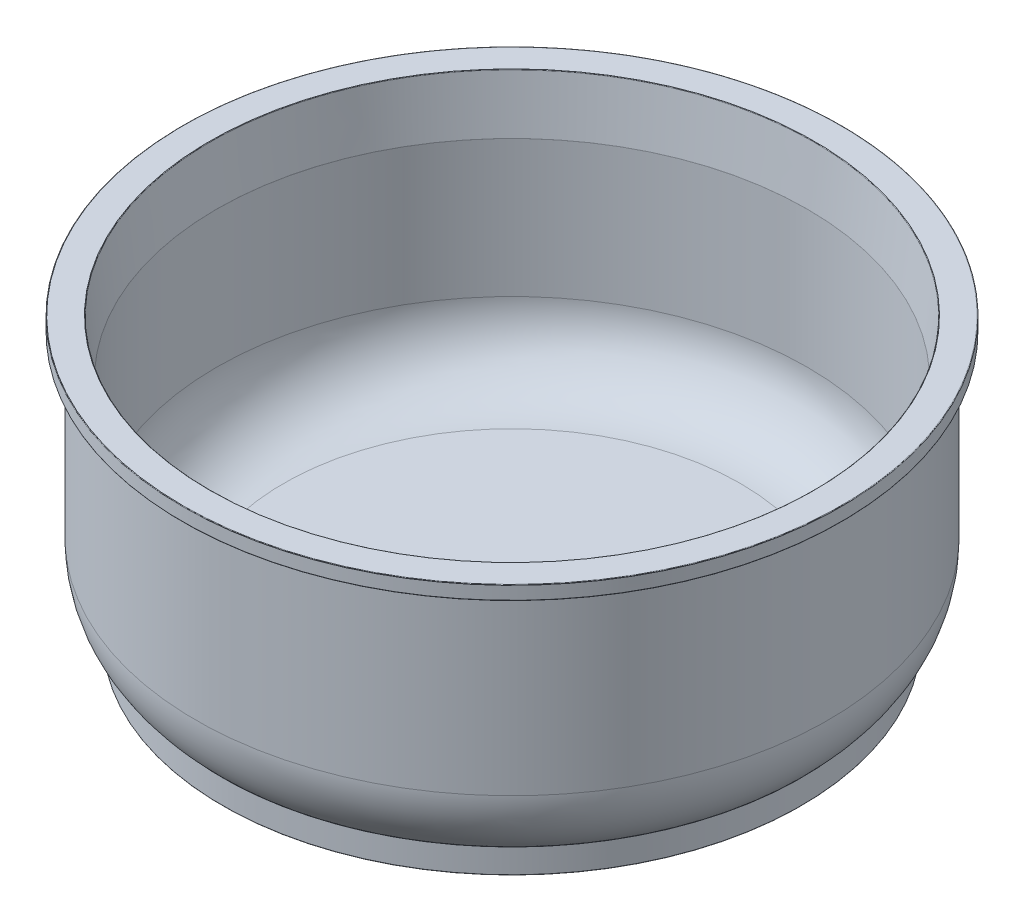
ISO-10303-21;
HEADER;
FILE_DESCRIPTION(('STEP AP214'),'2;1');
FILE_NAME('part.step','',(''),(''),'','','');
FILE_SCHEMA(('AUTOMOTIVE_DESIGN { 1 0 10303 214 1 1 1 1 }'));
ENDSEC;
DATA;
#1=APPLICATION_CONTEXT('core data for automotive mechanical design processes');
#2=APPLICATION_PROTOCOL_DEFINITION('international standard','automotive_design',2000,#1);
#3=PRODUCT_CONTEXT('',#1,'mechanical');
#4=PRODUCT('Part','Part','',(#3));
#5=PRODUCT_RELATED_PRODUCT_CATEGORY('part','',(#4));
#6=PRODUCT_DEFINITION_FORMATION('','',#4);
#7=PRODUCT_DEFINITION_CONTEXT('part definition',#1,'design');
#8=PRODUCT_DEFINITION('design','',#6,#7);
#9=PRODUCT_DEFINITION_SHAPE('','',#8);
#10=(LENGTH_UNIT() NAMED_UNIT(*) SI_UNIT(.MILLI.,.METRE.));
#11=(NAMED_UNIT(*) PLANE_ANGLE_UNIT() SI_UNIT($,.RADIAN.));
#12=(NAMED_UNIT(*) SI_UNIT($,.STERADIAN.) SOLID_ANGLE_UNIT());
#13=UNCERTAINTY_MEASURE_WITH_UNIT(LENGTH_MEASURE(1.E-05),#10,'distance_accuracy_value','');
#14=(GEOMETRIC_REPRESENTATION_CONTEXT(3) GLOBAL_UNCERTAINTY_ASSIGNED_CONTEXT((#13)) GLOBAL_UNIT_ASSIGNED_CONTEXT((#10,
#11,#12)) REPRESENTATION_CONTEXT('',''));
#15=CARTESIAN_POINT('',(0.,0.,0.));
#16=DIRECTION('',(0.,0.,1.));
#17=DIRECTION('',(1.,0.,0.));
#18=AXIS2_PLACEMENT_3D('',#15,#16,#17);
#19=CARTESIAN_POINT('',(0.,52.39,0.));
#20=DIRECTION('',(0.,-1.,0.));
#21=DIRECTION('',(0.,0.,-1.));
#22=AXIS2_PLACEMENT_3D('',#19,#20,#21);
#23=TOROIDAL_SURFACE('',#22,136.11,40.);
#24=CARTESIAN_POINT('',(0.,52.39,0.));
#25=DIRECTION('',(0.,-1.,0.));
#26=DIRECTION('',(0.,0.,-1.));
#27=AXIS2_PLACEMENT_3D('',#24,#25,#26);
#28=CIRCLE('',#27,176.11);
#29=CARTESIAN_POINT('',(0.,52.39,-176.11));
#30=VERTEX_POINT('',#29);
#31=EDGE_CURVE('E104',#30,#30,#28,.T.);
#32=ORIENTED_EDGE('',*,*,#31,.F.);
#33=EDGE_LOOP('',(#32));
#34=FACE_BOUND('',#33,.T.);
#35=CARTESIAN_POINT('',(0.,12.39,0.));
#36=DIRECTION('',(0.,-1.,0.));
#37=DIRECTION('',(0.,0.,-1.));
#38=AXIS2_PLACEMENT_3D('',#35,#36,#37);
#39=CIRCLE('',#38,136.11);
#40=CARTESIAN_POINT('',(0.,12.39,-136.11));
#41=VERTEX_POINT('',#40);
#42=EDGE_CURVE('E95',#41,#41,#39,.T.);
#43=ORIENTED_EDGE('',*,*,#42,.T.);
#44=EDGE_LOOP('',(#43));
#45=FACE_BOUND('',#44,.T.);
#46=ADVANCED_FACE('F33',(#34,#45),#23,.F.);
#47=CARTESIAN_POINT('',(0.,12.39,0.));
#48=DIRECTION('',(0.,-1.,0.));
#49=DIRECTION('',(0.,0.,-1.));
#50=AXIS2_PLACEMENT_3D('',#47,#48,#49);
#51=PLANE('',#50);
#52=ORIENTED_EDGE('',*,*,#42,.F.);
#53=EDGE_LOOP('',(#52));
#54=FACE_BOUND('',#53,.T.);
#55=ADVANCED_FACE('F112',(#54),#51,.F.);
#56=CARTESIAN_POINT('',(0.,0.,0.));
#57=DIRECTION('',(0.,-1.,0.));
#58=DIRECTION('',(0.,0.,-1.));
#59=AXIS2_PLACEMENT_3D('',#56,#57,#58);
#60=PLANE('',#59);
#61=CARTESIAN_POINT('',(0.,0.,0.));
#62=DIRECTION('',(0.,-1.,0.));
#63=DIRECTION('',(0.,0.,-1.));
#64=AXIS2_PLACEMENT_3D('',#61,#62,#63);
#65=CIRCLE('',#64,136.11);
#66=CARTESIAN_POINT('',(0.,0.,-136.11));
#67=VERTEX_POINT('',#66);
#68=EDGE_CURVE('E98',#67,#67,#65,.T.);
#69=ORIENTED_EDGE('',*,*,#68,.T.);
#70=EDGE_LOOP('',(#69));
#71=FACE_BOUND('',#70,.T.);
#72=ADVANCED_FACE('F117',(#71),#60,.T.);
#73=CARTESIAN_POINT('',(0.,52.39,0.));
#74=DIRECTION('',(0.,-1.,0.));
#75=DIRECTION('',(0.,0.,-1.));
#76=AXIS2_PLACEMENT_3D('',#73,#74,#75);
#77=TOROIDAL_SURFACE('',#76,136.11,52.39);
#78=CARTESIAN_POINT('',(0.,7.87935811300246,0.));
#79=DIRECTION('',(0.,1.,0.));
#80=DIRECTION('',(0.,0.,1.));
#81=AXIS2_PLACEMENT_3D('',#78,#79,#80);
#82=CIRCLE('',#81,163.741772632378);
#83=CARTESIAN_POINT('',(0.,7.87935811300246,163.741772632378));
#84=VERTEX_POINT('',#83);
#85=EDGE_CURVE('E77',#84,#84,#82,.F.);
#86=ORIENTED_EDGE('',*,*,#85,.T.);
#87=EDGE_LOOP('',(#86));
#88=FACE_BOUND('',#87,.T.);
#89=ORIENTED_EDGE('',*,*,#68,.F.);
#90=EDGE_LOOP('',(#89));
#91=FACE_BOUND('',#90,.T.);
#92=ADVANCED_FACE('F122',(#88,#91),#77,.T.);
#93=CARTESIAN_POINT('',(0.,0.,0.));
#94=DIRECTION('',(0.,-1.,0.));
#95=DIRECTION('',(0.,0.,-1.));
#96=AXIS2_PLACEMENT_3D('',#93,#94,#95);
#97=CYLINDRICAL_SURFACE('',#96,164.2);
#98=CARTESIAN_POINT('',(0.,7.62447755247349,0.));
#99=DIRECTION('',(0.,-1.,0.));
#100=DIRECTION('',(0.,0.,-1.));
#101=AXIS2_PLACEMENT_3D('',#98,#99,#100);
#102=CIRCLE('',#101,164.2);
#103=CARTESIAN_POINT('',(0.,7.62447755247349,-164.2));
#104=VERTEX_POINT('',#103);
#105=EDGE_CURVE('E71',#104,#104,#102,.F.);
#106=ORIENTED_EDGE('',*,*,#105,.T.);
#107=EDGE_LOOP('',(#106));
#108=FACE_BOUND('',#107,.T.);
#109=CARTESIAN_POINT('',(0.,0.3,0.));
#110=DIRECTION('',(0.,-1.,0.));
#111=DIRECTION('',(0.,0.,-1.));
#112=AXIS2_PLACEMENT_3D('',#109,#110,#111);
#113=CIRCLE('',#112,164.2);
#114=CARTESIAN_POINT('',(0.,0.3,-164.2));
#115=VERTEX_POINT('',#114);
#116=EDGE_CURVE('E74',#115,#115,#113,.T.);
#117=ORIENTED_EDGE('',*,*,#116,.T.);
#118=EDGE_LOOP('',(#117));
#119=FACE_BOUND('',#118,.T.);
#120=ADVANCED_FACE('F194',(#108,#119),#97,.F.);
#121=CARTESIAN_POINT('',(0.,0.,0.));
#122=DIRECTION('',(0.,-1.,0.));
#123=DIRECTION('',(0.,0.,-1.));
#124=AXIS2_PLACEMENT_3D('',#121,#122,#123);
#125=PLANE('',#124);
#126=CARTESIAN_POINT('',(0.,0.,0.));
#127=DIRECTION('',(0.,-1.,0.));
#128=DIRECTION('',(0.,0.,-1.));
#129=AXIS2_PLACEMENT_3D('',#126,#127,#128);
#130=CIRCLE('',#129,164.5);
#131=CARTESIAN_POINT('',(0.,0.,-164.5));
#132=VERTEX_POINT('',#131);
#133=EDGE_CURVE('E65',#132,#132,#130,.F.);
#134=ORIENTED_EDGE('',*,*,#133,.T.);
#135=EDGE_LOOP('',(#134));
#136=FACE_BOUND('',#135,.T.);
#137=CARTESIAN_POINT('',(0.,0.,0.));
#138=DIRECTION('',(0.,-1.,0.));
#139=DIRECTION('',(0.,0.,-1.));
#140=AXIS2_PLACEMENT_3D('',#137,#138,#139);
#141=CIRCLE('',#140,172.2);
#142=CARTESIAN_POINT('',(0.,0.,-172.2));
#143=VERTEX_POINT('',#142);
#144=EDGE_CURVE('E68',#143,#143,#141,.T.);
#145=ORIENTED_EDGE('',*,*,#144,.T.);
#146=EDGE_LOOP('',(#145));
#147=FACE_BOUND('',#146,.T.);
#148=ADVANCED_FACE('F191',(#136,#147),#125,.T.);
#149=CARTESIAN_POINT('',(0.,0.,0.));
#150=DIRECTION('',(0.,-1.,0.));
#151=DIRECTION('',(0.,0.,-1.));
#152=AXIS2_PLACEMENT_3D('',#149,#150,#151);
#153=CYLINDRICAL_SURFACE('',#152,172.5);
#154=CARTESIAN_POINT('',(0.,0.3,0.));
#155=DIRECTION('',(0.,-1.,0.));
#156=DIRECTION('',(0.,0.,-1.));
#157=AXIS2_PLACEMENT_3D('',#154,#155,#156);
#158=CIRCLE('',#157,172.5);
#159=CARTESIAN_POINT('',(0.,0.3,-172.5));
#160=VERTEX_POINT('',#159);
#161=EDGE_CURVE('E59',#160,#160,#158,.F.);
#162=ORIENTED_EDGE('',*,*,#161,.T.);
#163=EDGE_LOOP('',(#162));
#164=FACE_BOUND('',#163,.T.);
#165=CARTESIAN_POINT('',(0.,14.5736014406448,0.));
#166=DIRECTION('',(0.,-1.,0.));
#167=DIRECTION('',(0.,0.,-1.));
#168=AXIS2_PLACEMENT_3D('',#165,#166,#167);
#169=CIRCLE('',#168,172.5);
#170=CARTESIAN_POINT('',(0.,14.5736014406448,-172.5));
#171=VERTEX_POINT('',#170);
#172=EDGE_CURVE('E62',#171,#171,#169,.T.);
#173=ORIENTED_EDGE('',*,*,#172,.T.);
#174=EDGE_LOOP('',(#173));
#175=FACE_BOUND('',#174,.T.);
#176=ADVANCED_FACE('F187',(#164,#175),#153,.T.);
#177=CARTESIAN_POINT('',(0.,14.7889159133684,0.));
#178=DIRECTION('',(0.,1.,0.));
#179=DIRECTION('',(0.,0.,1.));
#180=AXIS2_PLACEMENT_3D('',#177,#178,#179);
#181=CIRCLE('',#180,172.591098880243);
#182=CARTESIAN_POINT('',(0.,14.7889159133684,172.591098880243));
#183=VERTEX_POINT('',#182);
#184=EDGE_CURVE('E56',#183,#183,#181,.T.);
#185=ORIENTED_EDGE('',*,*,#184,.T.);
#186=EDGE_LOOP('',(#185));
#187=FACE_BOUND('',#186,.T.);
#188=CARTESIAN_POINT('',(0.,52.39,0.));
#189=DIRECTION('',(0.,-1.,0.));
#190=DIRECTION('',(0.,0.,-1.));
#191=AXIS2_PLACEMENT_3D('',#188,#189,#190);
#192=CIRCLE('',#191,188.5);
#193=CARTESIAN_POINT('',(0.,52.39,-188.5));
#194=VERTEX_POINT('',#193);
#195=EDGE_CURVE('E101',#194,#194,#192,.T.);
#196=ORIENTED_EDGE('',*,*,#195,.T.);
#197=EDGE_LOOP('',(#196));
#198=FACE_BOUND('',#197,.T.);
#199=ADVANCED_FACE('F184',(#187,#198),#77,.T.);
#200=CARTESIAN_POINT('',(0.,0.,0.));
#201=DIRECTION('',(0.,-1.,0.));
#202=DIRECTION('',(0.,0.,-1.));
#203=AXIS2_PLACEMENT_3D('',#200,#201,#202);
#204=CYLINDRICAL_SURFACE('',#203,188.5);
#205=CARTESIAN_POINT('',(0.,158.4,0.));
#206=DIRECTION('',(0.,-1.,0.));
#207=DIRECTION('',(0.,0.,-1.));
#208=AXIS2_PLACEMENT_3D('',#205,#206,#207);
#209=CIRCLE('',#208,188.5);
#210=CARTESIAN_POINT('',(0.,158.4,-188.5));
#211=VERTEX_POINT('',#210);
#212=EDGE_CURVE('E10',#211,#211,#209,.T.);
#213=ORIENTED_EDGE('',*,*,#212,.T.);
#214=EDGE_LOOP('',(#213));
#215=FACE_BOUND('',#214,.T.);
#216=ORIENTED_EDGE('',*,*,#195,.F.);
#217=EDGE_LOOP('',(#216));
#218=FACE_BOUND('',#217,.T.);
#219=ADVANCED_FACE('F177',(#215,#218),#204,.T.);
#220=CARTESIAN_POINT('',(0.,158.7,0.));
#221=DIRECTION('',(0.,-1.,0.));
#222=DIRECTION('',(0.,0.,-1.));
#223=AXIS2_PLACEMENT_3D('',#220,#221,#222);
#224=PLANE('',#223);
#225=CARTESIAN_POINT('',(0.,158.7,0.));
#226=DIRECTION('',(0.,-1.,0.));
#227=DIRECTION('',(0.,0.,-1.));
#228=AXIS2_PLACEMENT_3D('',#225,#226,#227);
#229=CIRCLE('',#228,196.2);
#230=CARTESIAN_POINT('',(0.,158.7,-196.2));
#231=VERTEX_POINT('',#230);
#232=EDGE_CURVE('E48',#231,#231,#229,.T.);
#233=ORIENTED_EDGE('',*,*,#232,.T.);
#234=EDGE_LOOP('',(#233));
#235=FACE_BOUND('',#234,.T.);
#236=CARTESIAN_POINT('',(0.,158.7,0.));
#237=DIRECTION('',(0.,-1.,0.));
#238=DIRECTION('',(0.,0.,-1.));
#239=AXIS2_PLACEMENT_3D('',#236,#237,#238);
#240=CIRCLE('',#239,188.8);
#241=CARTESIAN_POINT('',(0.,158.7,-188.8));
#242=VERTEX_POINT('',#241);
#243=EDGE_CURVE('E53',#242,#242,#240,.F.);
#244=ORIENTED_EDGE('',*,*,#243,.T.);
#245=EDGE_LOOP('',(#244));
#246=FACE_BOUND('',#245,.T.);
#247=ADVANCED_FACE('F168',(#235,#246),#224,.T.);
#248=CARTESIAN_POINT('',(0.,0.,0.));
#249=DIRECTION('',(0.,-1.,0.));
#250=DIRECTION('',(0.,0.,-1.));
#251=AXIS2_PLACEMENT_3D('',#248,#249,#250);
#252=CYLINDRICAL_SURFACE('',#251,196.5);
#253=CARTESIAN_POINT('',(0.,159.,0.));
#254=DIRECTION('',(0.,-1.,0.));
#255=DIRECTION('',(0.,0.,-1.));
#256=AXIS2_PLACEMENT_3D('',#253,#254,#255);
#257=CIRCLE('',#256,196.5);
#258=CARTESIAN_POINT('',(0.,159.,-196.5));
#259=VERTEX_POINT('',#258);
#260=EDGE_CURVE('E40',#259,#259,#257,.F.);
#261=ORIENTED_EDGE('',*,*,#260,.T.);
#262=EDGE_LOOP('',(#261));
#263=FACE_BOUND('',#262,.T.);
#264=CARTESIAN_POINT('',(0.,166.7,0.));
#265=DIRECTION('',(0.,1.,0.));
#266=DIRECTION('',(0.,0.,1.));
#267=AXIS2_PLACEMENT_3D('',#264,#265,#266);
#268=CIRCLE('',#267,196.5);
#269=CARTESIAN_POINT('',(0.,166.7,196.5));
#270=VERTEX_POINT('',#269);
#271=EDGE_CURVE('E44',#270,#270,#268,.F.);
#272=ORIENTED_EDGE('',*,*,#271,.T.);
#273=EDGE_LOOP('',(#272));
#274=FACE_BOUND('',#273,.T.);
#275=ADVANCED_FACE('F165',(#263,#274),#252,.T.);
#276=CARTESIAN_POINT('',(8.4276020505637E-13,167.,0.));
#277=DIRECTION('',(0.,1.,0.));
#278=DIRECTION('',(0.,0.,1.));
#279=AXIS2_PLACEMENT_3D('',#276,#277,#278);
#280=PLANE('',#279);
#281=CARTESIAN_POINT('',(0.,167.,0.));
#282=DIRECTION('',(0.,1.,0.));
#283=DIRECTION('',(0.,0.,1.));
#284=AXIS2_PLACEMENT_3D('',#281,#282,#283);
#285=CIRCLE('',#284,180.266713484215);
#286=CARTESIAN_POINT('',(0.,167.,180.266713484215));
#287=VERTEX_POINT('',#286);
#288=EDGE_CURVE('E89',#287,#287,#285,.F.);
#289=ORIENTED_EDGE('',*,*,#288,.T.);
#290=EDGE_LOOP('',(#289));
#291=FACE_BOUND('',#290,.T.);
#292=CARTESIAN_POINT('',(0.,167.,0.));
#293=DIRECTION('',(0.,1.,0.));
#294=DIRECTION('',(0.,0.,1.));
#295=AXIS2_PLACEMENT_3D('',#292,#293,#294);
#296=CIRCLE('',#295,196.2);
#297=CARTESIAN_POINT('',(0.,167.,196.2));
#298=VERTEX_POINT('',#297);
#299=EDGE_CURVE('E92',#298,#298,#296,.T.);
#300=ORIENTED_EDGE('',*,*,#299,.T.);
#301=EDGE_LOOP('',(#300));
#302=FACE_BOUND('',#301,.T.);
#303=ADVANCED_FACE('F167',(#291,#302),#280,.T.);
#304=CARTESIAN_POINT('',(0.,167.,0.));
#305=DIRECTION('',(0.,1.,0.));
#306=DIRECTION('',(0.,0.,1.));
#307=AXIS2_PLACEMENT_3D('',#304,#305,#306);
#308=CONICAL_SURFACE('',#307,180.,0.117337303935576);
#309=CARTESIAN_POINT('',(0.,166.735120471517,0.));
#310=DIRECTION('',(0.,-1.,0.));
#311=DIRECTION('',(0.,0.,-1.));
#312=AXIS2_PLACEMENT_3D('',#309,#310,#311);
#313=CIRCLE('',#312,179.968776322248);
#314=CARTESIAN_POINT('',(0.,166.735120471517,-179.968776322248));
#315=VERTEX_POINT('',#314);
#316=EDGE_CURVE('E83',#315,#315,#313,.F.);
#317=ORIENTED_EDGE('',*,*,#316,.T.);
#318=EDGE_LOOP('',(#317));
#319=FACE_BOUND('',#318,.T.);
#320=CARTESIAN_POINT('',(0.,134.017499654272,0.));
#321=DIRECTION('',(0.,1.,0.));
#322=DIRECTION('',(0.,0.,1.));
#323=AXIS2_PLACEMENT_3D('',#320,#321,#322);
#324=CIRCLE('',#323,176.112062838034);
#325=CARTESIAN_POINT('',(0.,134.017499654272,176.112062838034));
#326=VERTEX_POINT('',#325);
#327=EDGE_CURVE('E86',#326,#326,#324,.F.);
#328=ORIENTED_EDGE('',*,*,#327,.T.);
#329=EDGE_LOOP('',(#328));
#330=FACE_BOUND('',#329,.T.);
#331=ADVANCED_FACE('F174',(#319,#330),#308,.F.);
#332=CARTESIAN_POINT('',(0.,0.,0.));
#333=DIRECTION('',(0.,-1.,0.));
#334=DIRECTION('',(0.,0.,-1.));
#335=AXIS2_PLACEMENT_3D('',#332,#333,#334);
#336=CYLINDRICAL_SURFACE('',#335,176.11);
#337=CARTESIAN_POINT('',(0.,133.982379182755,0.));
#338=DIRECTION('',(0.,1.,0.));
#339=DIRECTION('',(0.,0.,1.));
#340=AXIS2_PLACEMENT_3D('',#337,#338,#339);
#341=CIRCLE('',#340,176.11);
#342=CARTESIAN_POINT('',(0.,133.982379182755,176.11));
#343=VERTEX_POINT('',#342);
#344=EDGE_CURVE('E80',#343,#343,#341,.T.);
#345=ORIENTED_EDGE('',*,*,#344,.T.);
#346=EDGE_LOOP('',(#345));
#347=FACE_BOUND('',#346,.T.);
#348=ORIENTED_EDGE('',*,*,#31,.T.);
#349=EDGE_LOOP('',(#348));
#350=FACE_BOUND('',#349,.T.);
#351=ADVANCED_FACE('F108',(#347,#350),#336,.F.);
#352=CARTESIAN_POINT('',(0.,166.7,0.));
#353=DIRECTION('',(0.,1.,0.));
#354=DIRECTION('',(0.,0.,1.));
#355=AXIS2_PLACEMENT_3D('',#352,#353,#354);
#356=TOROIDAL_SURFACE('',#355,180.266713484215,0.3);
#357=ORIENTED_EDGE('',*,*,#316,.F.);
#358=EDGE_LOOP('',(#357));
#359=FACE_BOUND('',#358,.T.);
#360=ORIENTED_EDGE('',*,*,#288,.F.);
#361=EDGE_LOOP('',(#360));
#362=FACE_BOUND('',#361,.T.);
#363=ADVANCED_FACE('F127',(#359,#362),#356,.T.);
#364=CARTESIAN_POINT('',(0.,133.982379182755,0.));
#365=DIRECTION('',(0.,1.,0.));
#366=DIRECTION('',(0.,0.,1.));
#367=AXIS2_PLACEMENT_3D('',#364,#365,#366);
#368=TOROIDAL_SURFACE('',#367,176.41,0.3);
#369=ORIENTED_EDGE('',*,*,#344,.F.);
#370=EDGE_LOOP('',(#369));
#371=FACE_BOUND('',#370,.T.);
#372=ORIENTED_EDGE('',*,*,#327,.F.);
#373=EDGE_LOOP('',(#372));
#374=FACE_BOUND('',#373,.T.);
#375=ADVANCED_FACE('F130',(#371,#374),#368,.T.);
#376=CARTESIAN_POINT('',(0.,7.62447755247349,0.));
#377=DIRECTION('',(0.,-1.,0.));
#378=DIRECTION('',(0.,0.,-1.));
#379=AXIS2_PLACEMENT_3D('',#376,#377,#378);
#380=TOROIDAL_SURFACE('',#379,163.9,0.3);
#381=ORIENTED_EDGE('',*,*,#105,.F.);
#382=EDGE_LOOP('',(#381));
#383=FACE_BOUND('',#382,.T.);
#384=ORIENTED_EDGE('',*,*,#85,.F.);
#385=EDGE_LOOP('',(#384));
#386=FACE_BOUND('',#385,.T.);
#387=ADVANCED_FACE('F134',(#383,#386),#380,.F.);
#388=CARTESIAN_POINT('',(0.,0.3,0.));
#389=DIRECTION('',(0.,-1.,0.));
#390=DIRECTION('',(0.,0.,-1.));
#391=AXIS2_PLACEMENT_3D('',#388,#389,#390);
#392=TOROIDAL_SURFACE('',#391,164.5,0.3);
#393=ORIENTED_EDGE('',*,*,#133,.F.);
#394=EDGE_LOOP('',(#393));
#395=FACE_BOUND('',#394,.T.);
#396=ORIENTED_EDGE('',*,*,#116,.F.);
#397=EDGE_LOOP('',(#396));
#398=FACE_BOUND('',#397,.T.);
#399=ADVANCED_FACE('F138',(#395,#398),#392,.T.);
#400=CARTESIAN_POINT('',(0.,0.3,0.));
#401=DIRECTION('',(0.,-1.,0.));
#402=DIRECTION('',(0.,0.,-1.));
#403=AXIS2_PLACEMENT_3D('',#400,#401,#402);
#404=TOROIDAL_SURFACE('',#403,172.2,0.3);
#405=ORIENTED_EDGE('',*,*,#161,.F.);
#406=EDGE_LOOP('',(#405));
#407=FACE_BOUND('',#406,.T.);
#408=ORIENTED_EDGE('',*,*,#144,.F.);
#409=EDGE_LOOP('',(#408));
#410=FACE_BOUND('',#409,.T.);
#411=ADVANCED_FACE('F142',(#407,#410),#404,.T.);
#412=CARTESIAN_POINT('',(0.,14.5736014406448,0.));
#413=DIRECTION('',(0.,-1.,0.));
#414=DIRECTION('',(0.,0.,-1.));
#415=AXIS2_PLACEMENT_3D('',#412,#413,#414);
#416=TOROIDAL_SURFACE('',#415,172.8,0.3);
#417=ORIENTED_EDGE('',*,*,#184,.F.);
#418=EDGE_LOOP('',(#417));
#419=FACE_BOUND('',#418,.T.);
#420=ORIENTED_EDGE('',*,*,#172,.F.);
#421=EDGE_LOOP('',(#420));
#422=FACE_BOUND('',#421,.T.);
#423=ADVANCED_FACE('F146',(#419,#422),#416,.F.);
#424=CARTESIAN_POINT('',(0.,159.,0.));
#425=DIRECTION('',(0.,-1.,0.));
#426=DIRECTION('',(0.,0.,-1.));
#427=AXIS2_PLACEMENT_3D('',#424,#425,#426);
#428=TOROIDAL_SURFACE('',#427,196.2,0.3);
#429=ORIENTED_EDGE('',*,*,#260,.F.);
#430=EDGE_LOOP('',(#429));
#431=FACE_BOUND('',#430,.T.);
#432=ORIENTED_EDGE('',*,*,#232,.F.);
#433=EDGE_LOOP('',(#432));
#434=FACE_BOUND('',#433,.T.);
#435=ADVANCED_FACE('F150',(#431,#434),#428,.T.);
#436=CARTESIAN_POINT('',(0.,166.7,0.));
#437=DIRECTION('',(0.,1.,0.));
#438=DIRECTION('',(0.,0.,1.));
#439=AXIS2_PLACEMENT_3D('',#436,#437,#438);
#440=TOROIDAL_SURFACE('',#439,196.2,0.3);
#441=ORIENTED_EDGE('',*,*,#299,.F.);
#442=EDGE_LOOP('',(#441));
#443=FACE_BOUND('',#442,.T.);
#444=ORIENTED_EDGE('',*,*,#271,.F.);
#445=EDGE_LOOP('',(#444));
#446=FACE_BOUND('',#445,.T.);
#447=ADVANCED_FACE('F153',(#443,#446),#440,.T.);
#448=CARTESIAN_POINT('',(0.,158.4,0.));
#449=DIRECTION('',(0.,-1.,0.));
#450=DIRECTION('',(0.,0.,-1.));
#451=AXIS2_PLACEMENT_3D('',#448,#449,#450);
#452=TOROIDAL_SURFACE('',#451,188.8,0.3);
#453=ORIENTED_EDGE('',*,*,#243,.F.);
#454=EDGE_LOOP('',(#453));
#455=FACE_BOUND('',#454,.T.);
#456=ORIENTED_EDGE('',*,*,#212,.F.);
#457=EDGE_LOOP('',(#456));
#458=FACE_BOUND('',#457,.T.);
#459=ADVANCED_FACE('F35',(#455,#458),#452,.F.);
#460=CLOSED_SHELL('',(#46,#55,#72,#92,#120,#148,#176,#199,#219,#247,#275,#303,#331,#351,#363,
#375,#387,#399,#411,#423,#435,#447,#459));
#461=MANIFOLD_SOLID_BREP('B2',#460);
#462=ADVANCED_BREP_SHAPE_REPRESENTATION('',(#18,#461),#14);
#463=SHAPE_DEFINITION_REPRESENTATION(#9,#462);
ENDSEC;
END-ISO-10303-21;
